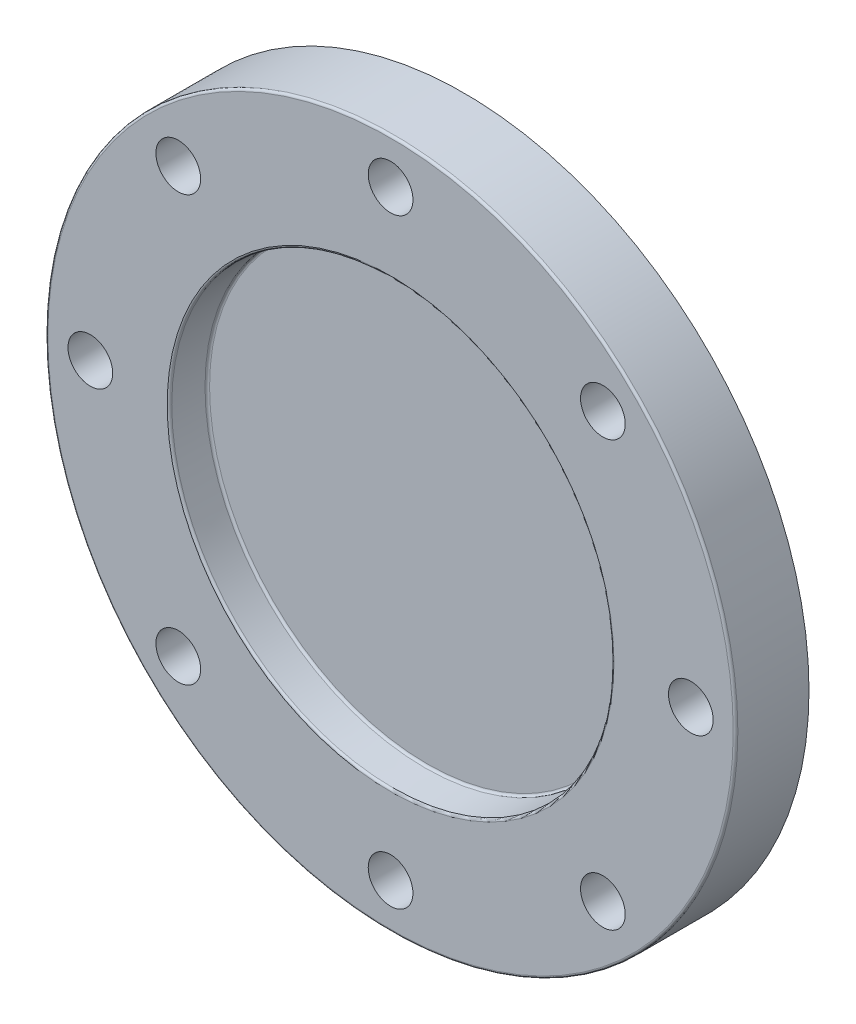
ISO-10303-21;
HEADER;
FILE_DESCRIPTION(('STEP AP214'),'2;1');
FILE_NAME('part.step','',(''),(''),'','','');
FILE_SCHEMA(('AUTOMOTIVE_DESIGN { 1 0 10303 214 1 1 1 1 }'));
ENDSEC;
DATA;
#1=APPLICATION_CONTEXT('core data for automotive mechanical design processes');
#2=APPLICATION_PROTOCOL_DEFINITION('international standard','automotive_design',2000,#1);
#3=PRODUCT_CONTEXT('',#1,'mechanical');
#4=PRODUCT('Part','Part','',(#3));
#5=PRODUCT_RELATED_PRODUCT_CATEGORY('part','',(#4));
#6=PRODUCT_DEFINITION_FORMATION('','',#4);
#7=PRODUCT_DEFINITION_CONTEXT('part definition',#1,'design');
#8=PRODUCT_DEFINITION('design','',#6,#7);
#9=PRODUCT_DEFINITION_SHAPE('','',#8);
#10=(LENGTH_UNIT() NAMED_UNIT(*) SI_UNIT(.MILLI.,.METRE.));
#11=(NAMED_UNIT(*) PLANE_ANGLE_UNIT() SI_UNIT($,.RADIAN.));
#12=(NAMED_UNIT(*) SI_UNIT($,.STERADIAN.) SOLID_ANGLE_UNIT());
#13=UNCERTAINTY_MEASURE_WITH_UNIT(LENGTH_MEASURE(1.E-05),#10,'distance_accuracy_value','');
#14=(GEOMETRIC_REPRESENTATION_CONTEXT(3) GLOBAL_UNCERTAINTY_ASSIGNED_CONTEXT((#13)) GLOBAL_UNIT_ASSIGNED_CONTEXT((#10,
#11,#12)) REPRESENTATION_CONTEXT('',''));
#15=CARTESIAN_POINT('',(0.,0.,0.));
#16=DIRECTION('',(0.,0.,1.));
#17=DIRECTION('',(1.,0.,0.));
#18=AXIS2_PLACEMENT_3D('',#15,#16,#17);
#19=CARTESIAN_POINT('',(0.,0.,36.5125));
#20=DIRECTION('',(0.,0.,-1.));
#21=DIRECTION('',(-1.,0.,0.));
#22=AXIS2_PLACEMENT_3D('',#19,#20,#21);
#23=CYLINDRICAL_SURFACE('',#22,171.45);
#24=CARTESIAN_POINT('',(0.,0.,35.3579545454545));
#25=DIRECTION('',(0.,0.,1.));
#26=DIRECTION('',(1.,0.,0.));
#27=AXIS2_PLACEMENT_3D('',#24,#25,#26);
#28=CIRCLE('',#27,171.45);
#29=CARTESIAN_POINT('',(171.45,0.,35.3579545454545));
#30=VERTEX_POINT('',#29);
#31=EDGE_CURVE('E10',#30,#30,#28,.F.);
#32=ORIENTED_EDGE('',*,*,#31,.T.);
#33=EDGE_LOOP('',(#32));
#34=FACE_BOUND('',#33,.T.);
#35=CARTESIAN_POINT('',(0.,0.,0.));
#36=DIRECTION('',(0.,0.,1.));
#37=DIRECTION('',(1.,0.,0.));
#38=AXIS2_PLACEMENT_3D('',#35,#36,#37);
#39=CIRCLE('',#38,171.45);
#40=CARTESIAN_POINT('',(171.45,0.,0.));
#41=VERTEX_POINT('',#40);
#42=EDGE_CURVE('E60',#41,#41,#39,.T.);
#43=ORIENTED_EDGE('',*,*,#42,.T.);
#44=EDGE_LOOP('',(#43));
#45=FACE_BOUND('',#44,.T.);
#46=ADVANCED_FACE('F34',(#34,#45),#23,.T.);
#47=CARTESIAN_POINT('',(0.,0.,36.5125));
#48=DIRECTION('',(0.,0.,1.));
#49=DIRECTION('',(1.,0.,0.));
#50=AXIS2_PLACEMENT_3D('',#47,#48,#49);
#51=PLANE('',#50);
#52=CARTESIAN_POINT('',(0.,0.,36.5125));
#53=DIRECTION('',(0.,0.,1.));
#54=DIRECTION('',(1.,0.,0.));
#55=AXIS2_PLACEMENT_3D('',#52,#53,#54);
#56=CIRCLE('',#55,111.037468728978);
#57=CARTESIAN_POINT('',(111.037468728978,0.,36.5125));
#58=VERTEX_POINT('',#57);
#59=EDGE_CURVE('E41',#58,#58,#56,.F.);
#60=ORIENTED_EDGE('',*,*,#59,.T.);
#61=EDGE_LOOP('',(#60));
#62=FACE_BOUND('',#61,.T.);
#63=CARTESIAN_POINT('',(0.,0.,36.5125));
#64=DIRECTION('',(0.,0.,1.));
#65=DIRECTION('',(1.,0.,0.));
#66=AXIS2_PLACEMENT_3D('',#63,#64,#65);
#67=CIRCLE('',#66,170.295454545455);
#68=CARTESIAN_POINT('',(170.295454545455,0.,36.5125));
#69=VERTEX_POINT('',#68);
#70=EDGE_CURVE('E45',#69,#69,#67,.T.);
#71=ORIENTED_EDGE('',*,*,#70,.T.);
#72=EDGE_LOOP('',(#71));
#73=FACE_BOUND('',#72,.T.);
#74=CARTESIAN_POINT('',(105.518009422561,105.518009422564,36.5125));
#75=DIRECTION('',(0.,0.,1.));
#76=DIRECTION('',(0.707106781186556,-0.707106781186539,0.));
#77=AXIS2_PLACEMENT_3D('',#74,#75,#76);
#78=CIRCLE('',#77,11.1125);
#79=CARTESIAN_POINT('',(113.375733528497,97.6602853166284,36.5125));
#80=VERTEX_POINT('',#79);
#81=EDGE_CURVE('E106',#80,#80,#78,.T.);
#82=ORIENTED_EDGE('',*,*,#81,.F.);
#83=EDGE_LOOP('',(#82));
#84=FACE_BOUND('',#83,.T.);
#85=CARTESIAN_POINT('',(149.225,1.5630489083666E-12,36.5125));
#86=DIRECTION('',(0.,0.,1.));
#87=DIRECTION('',(0.,-1.,0.));
#88=AXIS2_PLACEMENT_3D('',#85,#86,#87);
#89=CIRCLE('',#88,11.1125);
#90=CARTESIAN_POINT('',(149.225,-11.1124999999984,36.5125));
#91=VERTEX_POINT('',#90);
#92=EDGE_CURVE('E100',#91,#91,#89,.T.);
#93=ORIENTED_EDGE('',*,*,#92,.F.);
#94=EDGE_LOOP('',(#93));
#95=FACE_BOUND('',#94,.T.);
#96=CARTESIAN_POINT('',(105.518009422563,-105.518009422562,36.5125));
#97=DIRECTION('',(0.,0.,1.));
#98=DIRECTION('',(-0.707106781186541,-0.707106781186554,0.));
#99=AXIS2_PLACEMENT_3D('',#96,#97,#98);
#100=CIRCLE('',#99,11.1125);
#101=CARTESIAN_POINT('',(97.660285316628,-113.375733528497,36.5125));
#102=VERTEX_POINT('',#101);
#103=EDGE_CURVE('E94',#102,#102,#100,.T.);
#104=ORIENTED_EDGE('',*,*,#103,.F.);
#105=EDGE_LOOP('',(#104));
#106=FACE_BOUND('',#105,.T.);
#107=CARTESIAN_POINT('',(1.04203260557773E-12,-149.225,36.5125));
#108=DIRECTION('',(0.,0.,1.));
#109=DIRECTION('',(-1.,0.,0.));
#110=AXIS2_PLACEMENT_3D('',#107,#108,#109);
#111=CIRCLE('',#110,11.1125);
#112=CARTESIAN_POINT('',(-11.112499999999,-149.225,36.5125));
#113=VERTEX_POINT('',#112);
#114=EDGE_CURVE('E88',#113,#113,#111,.T.);
#115=ORIENTED_EDGE('',*,*,#114,.F.);
#116=EDGE_LOOP('',(#115));
#117=FACE_BOUND('',#116,.T.);
#118=CARTESIAN_POINT('',(-105.518009422562,-105.518009422563,36.5125));
#119=DIRECTION('',(0.,0.,1.));
#120=DIRECTION('',(-0.707106781186551,0.707106781186544,0.));
#121=AXIS2_PLACEMENT_3D('',#118,#119,#120);
#122=CIRCLE('',#121,11.1125);
#123=CARTESIAN_POINT('',(-113.375733528498,-97.6602853166276,36.5125));
#124=VERTEX_POINT('',#123);
#125=EDGE_CURVE('E82',#124,#124,#122,.T.);
#126=ORIENTED_EDGE('',*,*,#125,.F.);
#127=EDGE_LOOP('',(#126));
#128=FACE_BOUND('',#127,.T.);
#129=CARTESIAN_POINT('',(-149.225,-5.21016302788867E-13,36.5125));
#130=DIRECTION('',(0.,0.,1.));
#131=DIRECTION('',(0.,1.,0.));
#132=AXIS2_PLACEMENT_3D('',#129,#130,#131);
#133=CIRCLE('',#132,11.1125);
#134=CARTESIAN_POINT('',(-149.225,11.1124999999995,36.5125));
#135=VERTEX_POINT('',#134);
#136=EDGE_CURVE('E76',#135,#135,#133,.T.);
#137=ORIENTED_EDGE('',*,*,#136,.F.);
#138=EDGE_LOOP('',(#137));
#139=FACE_BOUND('',#138,.T.);
#140=CARTESIAN_POINT('',(-105.518009422563,105.518009422562,36.5125));
#141=DIRECTION('',(0.,0.,1.));
#142=DIRECTION('',(0.707106781186546,0.707106781186549,0.));
#143=AXIS2_PLACEMENT_3D('',#140,#141,#142);
#144=CIRCLE('',#143,11.1125);
#145=CARTESIAN_POINT('',(-97.6602853166273,113.375733528498,36.5125));
#146=VERTEX_POINT('',#145);
#147=EDGE_CURVE('E70',#146,#146,#144,.T.);
#148=ORIENTED_EDGE('',*,*,#147,.F.);
#149=EDGE_LOOP('',(#148));
#150=FACE_BOUND('',#149,.T.);
#151=CARTESIAN_POINT('',(0.,149.225,36.5125));
#152=DIRECTION('',(0.,0.,1.));
#153=DIRECTION('',(1.,0.,0.));
#154=AXIS2_PLACEMENT_3D('',#151,#152,#153);
#155=CIRCLE('',#154,11.1125);
#156=CARTESIAN_POINT('',(11.1125,149.225,36.5125));
#157=VERTEX_POINT('',#156);
#158=EDGE_CURVE('E64',#157,#157,#155,.T.);
#159=ORIENTED_EDGE('',*,*,#158,.F.);
#160=EDGE_LOOP('',(#159));
#161=FACE_BOUND('',#160,.T.);
#162=ADVANCED_FACE('F123',(#62,#73,#84,#95,#106,#117,#128,#139,#150,#161),#51,.T.);
#163=CARTESIAN_POINT('',(0.,0.,0.));
#164=DIRECTION('',(0.,0.,1.));
#165=DIRECTION('',(1.,0.,0.));
#166=AXIS2_PLACEMENT_3D('',#163,#164,#165);
#167=PLANE('',#166);
#168=CARTESIAN_POINT('',(105.518009422561,105.518009422564,0.));
#169=DIRECTION('',(0.,0.,1.));
#170=DIRECTION('',(0.707106781186556,-0.707106781186539,0.));
#171=AXIS2_PLACEMENT_3D('',#168,#169,#170);
#172=CIRCLE('',#171,11.1125);
#173=CARTESIAN_POINT('',(113.375733528497,97.6602853166284,0.));
#174=VERTEX_POINT('',#173);
#175=EDGE_CURVE('E103',#174,#174,#172,.T.);
#176=ORIENTED_EDGE('',*,*,#175,.T.);
#177=EDGE_LOOP('',(#176));
#178=FACE_BOUND('',#177,.T.);
#179=CARTESIAN_POINT('',(149.225,1.5630489083666E-12,0.));
#180=DIRECTION('',(0.,0.,1.));
#181=DIRECTION('',(0.,-1.,0.));
#182=AXIS2_PLACEMENT_3D('',#179,#180,#181);
#183=CIRCLE('',#182,11.1125);
#184=CARTESIAN_POINT('',(149.225,-11.1124999999984,0.));
#185=VERTEX_POINT('',#184);
#186=EDGE_CURVE('E97',#185,#185,#183,.T.);
#187=ORIENTED_EDGE('',*,*,#186,.T.);
#188=EDGE_LOOP('',(#187));
#189=FACE_BOUND('',#188,.T.);
#190=CARTESIAN_POINT('',(105.518009422563,-105.518009422562,0.));
#191=DIRECTION('',(0.,0.,1.));
#192=DIRECTION('',(-0.707106781186541,-0.707106781186554,0.));
#193=AXIS2_PLACEMENT_3D('',#190,#191,#192);
#194=CIRCLE('',#193,11.1125);
#195=CARTESIAN_POINT('',(97.660285316628,-113.375733528497,0.));
#196=VERTEX_POINT('',#195);
#197=EDGE_CURVE('E91',#196,#196,#194,.T.);
#198=ORIENTED_EDGE('',*,*,#197,.T.);
#199=EDGE_LOOP('',(#198));
#200=FACE_BOUND('',#199,.T.);
#201=CARTESIAN_POINT('',(1.04203260557773E-12,-149.225,0.));
#202=DIRECTION('',(0.,0.,1.));
#203=DIRECTION('',(-1.,0.,0.));
#204=AXIS2_PLACEMENT_3D('',#201,#202,#203);
#205=CIRCLE('',#204,11.1125);
#206=CARTESIAN_POINT('',(-11.112499999999,-149.225,0.));
#207=VERTEX_POINT('',#206);
#208=EDGE_CURVE('E85',#207,#207,#205,.T.);
#209=ORIENTED_EDGE('',*,*,#208,.T.);
#210=EDGE_LOOP('',(#209));
#211=FACE_BOUND('',#210,.T.);
#212=CARTESIAN_POINT('',(-105.518009422562,-105.518009422563,0.));
#213=DIRECTION('',(0.,0.,1.));
#214=DIRECTION('',(-0.707106781186551,0.707106781186544,0.));
#215=AXIS2_PLACEMENT_3D('',#212,#213,#214);
#216=CIRCLE('',#215,11.1125);
#217=CARTESIAN_POINT('',(-113.375733528498,-97.6602853166276,0.));
#218=VERTEX_POINT('',#217);
#219=EDGE_CURVE('E79',#218,#218,#216,.T.);
#220=ORIENTED_EDGE('',*,*,#219,.T.);
#221=EDGE_LOOP('',(#220));
#222=FACE_BOUND('',#221,.T.);
#223=CARTESIAN_POINT('',(-149.225,-5.21016302788867E-13,0.));
#224=DIRECTION('',(0.,0.,1.));
#225=DIRECTION('',(0.,1.,0.));
#226=AXIS2_PLACEMENT_3D('',#223,#224,#225);
#227=CIRCLE('',#226,11.1125);
#228=CARTESIAN_POINT('',(-149.225,11.1124999999995,0.));
#229=VERTEX_POINT('',#228);
#230=EDGE_CURVE('E73',#229,#229,#227,.T.);
#231=ORIENTED_EDGE('',*,*,#230,.T.);
#232=EDGE_LOOP('',(#231));
#233=FACE_BOUND('',#232,.T.);
#234=CARTESIAN_POINT('',(-105.518009422563,105.518009422562,0.));
#235=DIRECTION('',(0.,0.,1.));
#236=DIRECTION('',(0.707106781186546,0.707106781186549,0.));
#237=AXIS2_PLACEMENT_3D('',#234,#235,#236);
#238=CIRCLE('',#237,11.1125);
#239=CARTESIAN_POINT('',(-97.6602853166273,113.375733528498,0.));
#240=VERTEX_POINT('',#239);
#241=EDGE_CURVE('E67',#240,#240,#238,.T.);
#242=ORIENTED_EDGE('',*,*,#241,.T.);
#243=EDGE_LOOP('',(#242));
#244=FACE_BOUND('',#243,.T.);
#245=CARTESIAN_POINT('',(0.,149.225,0.));
#246=DIRECTION('',(0.,0.,1.));
#247=DIRECTION('',(1.,0.,0.));
#248=AXIS2_PLACEMENT_3D('',#245,#246,#247);
#249=CIRCLE('',#248,11.1125);
#250=CARTESIAN_POINT('',(11.1125,149.225,0.));
#251=VERTEX_POINT('',#250);
#252=EDGE_CURVE('E63',#251,#251,#249,.T.);
#253=ORIENTED_EDGE('',*,*,#252,.T.);
#254=EDGE_LOOP('',(#253));
#255=FACE_BOUND('',#254,.T.);
#256=ORIENTED_EDGE('',*,*,#42,.F.);
#257=EDGE_LOOP('',(#256));
#258=FACE_BOUND('',#257,.T.);
#259=ADVANCED_FACE('F112',(#178,#189,#200,#211,#222,#233,#244,#255,#258),#167,.F.);
#260=CARTESIAN_POINT('',(0.,149.225,0.));
#261=DIRECTION('',(0.,0.,1.));
#262=DIRECTION('',(1.,0.,0.));
#263=AXIS2_PLACEMENT_3D('',#260,#261,#262);
#264=CYLINDRICAL_SURFACE('',#263,11.1125);
#265=ORIENTED_EDGE('',*,*,#252,.F.);
#266=EDGE_LOOP('',(#265));
#267=FACE_BOUND('',#266,.T.);
#268=ORIENTED_EDGE('',*,*,#158,.T.);
#269=EDGE_LOOP('',(#268));
#270=FACE_BOUND('',#269,.T.);
#271=ADVANCED_FACE('F141',(#267,#270),#264,.F.);
#272=CARTESIAN_POINT('',(-105.518009422563,105.518009422562,0.));
#273=DIRECTION('',(0.,0.,1.));
#274=DIRECTION('',(1.,0.,0.));
#275=AXIS2_PLACEMENT_3D('',#272,#273,#274);
#276=CYLINDRICAL_SURFACE('',#275,11.1125);
#277=ORIENTED_EDGE('',*,*,#241,.F.);
#278=EDGE_LOOP('',(#277));
#279=FACE_BOUND('',#278,.T.);
#280=ORIENTED_EDGE('',*,*,#147,.T.);
#281=EDGE_LOOP('',(#280));
#282=FACE_BOUND('',#281,.T.);
#283=ADVANCED_FACE('F143',(#279,#282),#276,.F.);
#284=CARTESIAN_POINT('',(-149.225,-5.21016302788867E-13,0.));
#285=DIRECTION('',(0.,0.,1.));
#286=DIRECTION('',(1.,0.,0.));
#287=AXIS2_PLACEMENT_3D('',#284,#285,#286);
#288=CYLINDRICAL_SURFACE('',#287,11.1125);
#289=ORIENTED_EDGE('',*,*,#230,.F.);
#290=EDGE_LOOP('',(#289));
#291=FACE_BOUND('',#290,.T.);
#292=ORIENTED_EDGE('',*,*,#136,.T.);
#293=EDGE_LOOP('',(#292));
#294=FACE_BOUND('',#293,.T.);
#295=ADVANCED_FACE('F150',(#291,#294),#288,.F.);
#296=CARTESIAN_POINT('',(-105.518009422562,-105.518009422563,0.));
#297=DIRECTION('',(0.,0.,1.));
#298=DIRECTION('',(1.,0.,0.));
#299=AXIS2_PLACEMENT_3D('',#296,#297,#298);
#300=CYLINDRICAL_SURFACE('',#299,11.1125);
#301=ORIENTED_EDGE('',*,*,#219,.F.);
#302=EDGE_LOOP('',(#301));
#303=FACE_BOUND('',#302,.T.);
#304=ORIENTED_EDGE('',*,*,#125,.T.);
#305=EDGE_LOOP('',(#304));
#306=FACE_BOUND('',#305,.T.);
#307=ADVANCED_FACE('F194',(#303,#306),#300,.F.);
#308=CARTESIAN_POINT('',(1.04203260557773E-12,-149.225,0.));
#309=DIRECTION('',(0.,0.,1.));
#310=DIRECTION('',(1.,0.,0.));
#311=AXIS2_PLACEMENT_3D('',#308,#309,#310);
#312=CYLINDRICAL_SURFACE('',#311,11.1125);
#313=ORIENTED_EDGE('',*,*,#208,.F.);
#314=EDGE_LOOP('',(#313));
#315=FACE_BOUND('',#314,.T.);
#316=ORIENTED_EDGE('',*,*,#114,.T.);
#317=EDGE_LOOP('',(#316));
#318=FACE_BOUND('',#317,.T.);
#319=ADVANCED_FACE('F190',(#315,#318),#312,.F.);
#320=CARTESIAN_POINT('',(105.518009422563,-105.518009422562,0.));
#321=DIRECTION('',(0.,0.,1.));
#322=DIRECTION('',(1.,0.,0.));
#323=AXIS2_PLACEMENT_3D('',#320,#321,#322);
#324=CYLINDRICAL_SURFACE('',#323,11.1125);
#325=ORIENTED_EDGE('',*,*,#197,.F.);
#326=EDGE_LOOP('',(#325));
#327=FACE_BOUND('',#326,.T.);
#328=ORIENTED_EDGE('',*,*,#103,.T.);
#329=EDGE_LOOP('',(#328));
#330=FACE_BOUND('',#329,.T.);
#331=ADVANCED_FACE('F186',(#327,#330),#324,.F.);
#332=CARTESIAN_POINT('',(149.225,1.5630489083666E-12,0.));
#333=DIRECTION('',(0.,0.,1.));
#334=DIRECTION('',(1.,0.,0.));
#335=AXIS2_PLACEMENT_3D('',#332,#333,#334);
#336=CYLINDRICAL_SURFACE('',#335,11.1125);
#337=ORIENTED_EDGE('',*,*,#186,.F.);
#338=EDGE_LOOP('',(#337));
#339=FACE_BOUND('',#338,.T.);
#340=ORIENTED_EDGE('',*,*,#92,.T.);
#341=EDGE_LOOP('',(#340));
#342=FACE_BOUND('',#341,.T.);
#343=ADVANCED_FACE('F119',(#339,#342),#336,.F.);
#344=CARTESIAN_POINT('',(105.518009422561,105.518009422564,0.));
#345=DIRECTION('',(0.,0.,1.));
#346=DIRECTION('',(1.,0.,0.));
#347=AXIS2_PLACEMENT_3D('',#344,#345,#346);
#348=CYLINDRICAL_SURFACE('',#347,11.1125);
#349=ORIENTED_EDGE('',*,*,#175,.F.);
#350=EDGE_LOOP('',(#349));
#351=FACE_BOUND('',#350,.T.);
#352=ORIENTED_EDGE('',*,*,#81,.T.);
#353=EDGE_LOOP('',(#352));
#354=FACE_BOUND('',#353,.T.);
#355=ADVANCED_FACE('F115',(#351,#354),#348,.F.);
#356=CARTESIAN_POINT('',(0.,109.347,18.25625));
#357=DIRECTION('',(0.,0.,-1.));
#358=DIRECTION('',(0.,1.,0.));
#359=AXIS2_PLACEMENT_3D('',#356,#357,#358);
#360=PLANE('',#359);
#361=CARTESIAN_POINT('',(0.,0.,18.25625));
#362=DIRECTION('',(0.,0.,-1.));
#363=DIRECTION('',(0.,1.,0.));
#364=AXIS2_PLACEMENT_3D('',#361,#362,#363);
#365=CIRCLE('',#364,108.228031271022);
#366=CARTESIAN_POINT('',(0.,108.228031271022,18.25625));
#367=VERTEX_POINT('',#366);
#368=EDGE_CURVE('E49',#367,#367,#365,.F.);
#369=ORIENTED_EDGE('',*,*,#368,.T.);
#370=EDGE_LOOP('',(#369));
#371=FACE_BOUND('',#370,.T.);
#372=ADVANCED_FACE('F118',(#371),#360,.F.);
#373=CARTESIAN_POINT('',(0.,0.,18.25625));
#374=DIRECTION('',(0.,0.,1.));
#375=DIRECTION('',(0.,-1.,0.));
#376=AXIS2_PLACEMENT_3D('',#373,#374,#375);
#377=CONICAL_SURFACE('',#376,109.347,0.0312941281419109);
#378=CARTESIAN_POINT('',(0.,0.,19.3746708580904));
#379=DIRECTION('',(0.,0.,1.));
#380=DIRECTION('',(0.,-1.,0.));
#381=AXIS2_PLACEMENT_3D('',#378,#379,#380);
#382=CIRCLE('',#381,109.382011435558);
#383=CARTESIAN_POINT('',(0.,-109.382011435558,19.3746708580904));
#384=VERTEX_POINT('',#383);
#385=EDGE_CURVE('E54',#384,#384,#382,.F.);
#386=ORIENTED_EDGE('',*,*,#385,.T.);
#387=EDGE_LOOP('',(#386));
#388=FACE_BOUND('',#387,.T.);
#389=CARTESIAN_POINT('',(0.,0.,35.3940791419096));
#390=DIRECTION('',(0.,0.,1.));
#391=DIRECTION('',(0.,-1.,0.));
#392=AXIS2_PLACEMENT_3D('',#389,#390,#391);
#393=CIRCLE('',#392,109.883488564442);
#394=CARTESIAN_POINT('',(0.,-109.883488564442,35.3940791419096));
#395=VERTEX_POINT('',#394);
#396=EDGE_CURVE('E57',#395,#395,#393,.T.);
#397=ORIENTED_EDGE('',*,*,#396,.T.);
#398=EDGE_LOOP('',(#397));
#399=FACE_BOUND('',#398,.T.);
#400=ADVANCED_FACE('F164',(#388,#399),#377,.F.);
#401=CARTESIAN_POINT('',(0.,0.,19.4107954545455));
#402=DIRECTION('',(0.,0.,-1.));
#403=DIRECTION('',(0.,1.,0.));
#404=AXIS2_PLACEMENT_3D('',#401,#402,#403);
#405=TOROIDAL_SURFACE('',#404,108.228031271022,1.15454545454545);
#406=ORIENTED_EDGE('',*,*,#368,.F.);
#407=EDGE_LOOP('',(#406));
#408=FACE_BOUND('',#407,.T.);
#409=ORIENTED_EDGE('',*,*,#385,.F.);
#410=EDGE_LOOP('',(#409));
#411=FACE_BOUND('',#410,.T.);
#412=ADVANCED_FACE('F161',(#408,#411),#405,.F.);
#413=CARTESIAN_POINT('',(0.,0.,35.3579545454545));
#414=DIRECTION('',(0.,0.,1.));
#415=DIRECTION('',(1.,0.,0.));
#416=AXIS2_PLACEMENT_3D('',#413,#414,#415);
#417=TOROIDAL_SURFACE('',#416,111.037468728978,1.15454545454545);
#418=ORIENTED_EDGE('',*,*,#396,.F.);
#419=EDGE_LOOP('',(#418));
#420=FACE_BOUND('',#419,.T.);
#421=ORIENTED_EDGE('',*,*,#59,.F.);
#422=EDGE_LOOP('',(#421));
#423=FACE_BOUND('',#422,.T.);
#424=ADVANCED_FACE('F163',(#420,#423),#417,.T.);
#425=CARTESIAN_POINT('',(0.,0.,35.3579545454545));
#426=DIRECTION('',(0.,0.,1.));
#427=DIRECTION('',(1.,0.,0.));
#428=AXIS2_PLACEMENT_3D('',#425,#426,#427);
#429=TOROIDAL_SURFACE('',#428,170.295454545455,1.15454545454545);
#430=ORIENTED_EDGE('',*,*,#31,.F.);
#431=EDGE_LOOP('',(#430));
#432=FACE_BOUND('',#431,.T.);
#433=ORIENTED_EDGE('',*,*,#70,.F.);
#434=EDGE_LOOP('',(#433));
#435=FACE_BOUND('',#434,.T.);
#436=ADVANCED_FACE('F36',(#432,#435),#429,.T.);
#437=CLOSED_SHELL('',(#46,#162,#259,#271,#283,#295,#307,#319,#331,#343,#355,#372,#400,#412,#424,#436));
#438=MANIFOLD_SOLID_BREP('B2',#437);
#439=ADVANCED_BREP_SHAPE_REPRESENTATION('',(#18,#438),#14);
#440=SHAPE_DEFINITION_REPRESENTATION(#9,#439);
ENDSEC;
END-ISO-10303-21;
